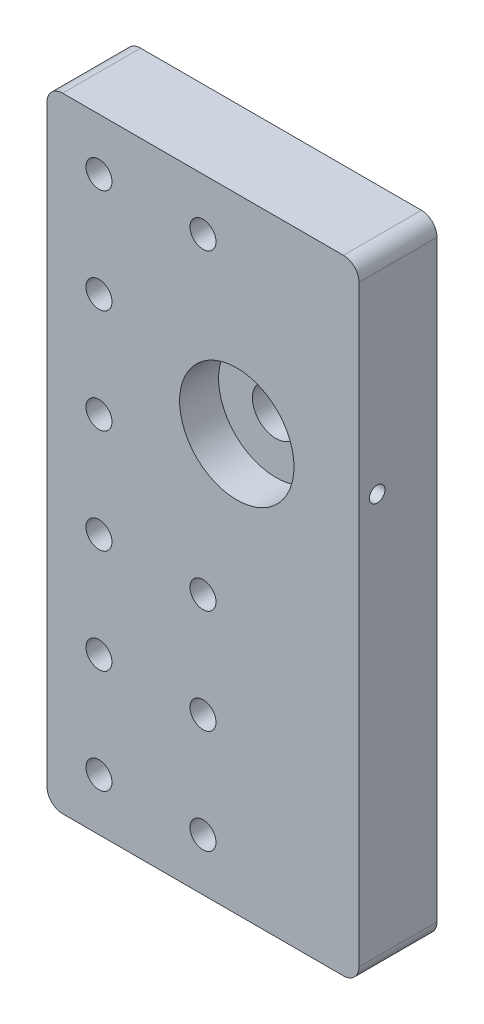
ISO-10303-21;
HEADER;
FILE_DESCRIPTION(('STEP AP214'),'2;1');
FILE_NAME('part.step','',(''),(''),'','','');
FILE_SCHEMA(('AUTOMOTIVE_DESIGN { 1 0 10303 214 1 1 1 1 }'));
ENDSEC;
DATA;
#1=APPLICATION_CONTEXT('core data for automotive mechanical design processes');
#2=APPLICATION_PROTOCOL_DEFINITION('international standard','automotive_design',2000,#1);
#3=PRODUCT_CONTEXT('',#1,'mechanical');
#4=PRODUCT('Part','Part','',(#3));
#5=PRODUCT_RELATED_PRODUCT_CATEGORY('part','',(#4));
#6=PRODUCT_DEFINITION_FORMATION('','',#4);
#7=PRODUCT_DEFINITION_CONTEXT('part definition',#1,'design');
#8=PRODUCT_DEFINITION('design','',#6,#7);
#9=PRODUCT_DEFINITION_SHAPE('','',#8);
#10=(LENGTH_UNIT() NAMED_UNIT(*) SI_UNIT(.MILLI.,.METRE.));
#11=(NAMED_UNIT(*) PLANE_ANGLE_UNIT() SI_UNIT($,.RADIAN.));
#12=(NAMED_UNIT(*) SI_UNIT($,.STERADIAN.) SOLID_ANGLE_UNIT());
#13=UNCERTAINTY_MEASURE_WITH_UNIT(LENGTH_MEASURE(1.E-05),#10,'distance_accuracy_value','');
#14=(GEOMETRIC_REPRESENTATION_CONTEXT(3) GLOBAL_UNCERTAINTY_ASSIGNED_CONTEXT((#13)) GLOBAL_UNIT_ASSIGNED_CONTEXT((#10,
#11,#12)) REPRESENTATION_CONTEXT('',''));
#15=CARTESIAN_POINT('',(0.,0.,0.));
#16=DIRECTION('',(0.,0.,1.));
#17=DIRECTION('',(1.,0.,0.));
#18=AXIS2_PLACEMENT_3D('',#15,#16,#17);
#19=CARTESIAN_POINT('',(36.5,80.,0.));
#20=DIRECTION('',(0.,0.,1.));
#21=DIRECTION('',(1.,0.,0.));
#22=AXIS2_PLACEMENT_3D('',#19,#20,#21);
#23=CYLINDRICAL_SURFACE('',#22,4.5);
#24=CARTESIAN_POINT('',(36.5,80.,0.));
#25=DIRECTION('',(0.,0.,1.));
#26=DIRECTION('',(1.,0.,0.));
#27=AXIS2_PLACEMENT_3D('',#24,#25,#26);
#28=CIRCLE('',#27,4.5);
#29=CARTESIAN_POINT('',(41.,80.,0.));
#30=VERTEX_POINT('',#29);
#31=EDGE_CURVE('E260',#30,#30,#28,.T.);
#32=ORIENTED_EDGE('',*,*,#31,.F.);
#33=EDGE_LOOP('',(#32));
#34=FACE_BOUND('',#33,.T.);
#35=CARTESIAN_POINT('',(36.5,80.,7.5));
#36=DIRECTION('',(0.,0.,1.));
#37=DIRECTION('',(1.,0.,0.));
#38=AXIS2_PLACEMENT_3D('',#35,#36,#37);
#39=CIRCLE('',#38,4.5);
#40=CARTESIAN_POINT('',(41.,80.,7.5));
#41=VERTEX_POINT('',#40);
#42=EDGE_CURVE('E424',#41,#41,#39,.T.);
#43=ORIENTED_EDGE('',*,*,#42,.T.);
#44=EDGE_LOOP('',(#43));
#45=FACE_BOUND('',#44,.T.);
#46=ADVANCED_FACE('F39',(#34,#45),#23,.F.);
#47=CARTESIAN_POINT('',(0.,0.,15.));
#48=DIRECTION('',(0.,0.,-1.));
#49=DIRECTION('',(-1.,0.,0.));
#50=AXIS2_PLACEMENT_3D('',#47,#48,#49);
#51=PLANE('',#50);
#52=CARTESIAN_POINT('',(36.5,80.,15.));
#53=DIRECTION('',(0.,0.,1.));
#54=DIRECTION('',(1.,0.,0.));
#55=AXIS2_PLACEMENT_3D('',#52,#53,#54);
#56=CIRCLE('',#55,11.);
#57=CARTESIAN_POINT('',(47.5,80.,15.));
#58=VERTEX_POINT('',#57);
#59=EDGE_CURVE('E422',#58,#58,#56,.T.);
#60=ORIENTED_EDGE('',*,*,#59,.F.);
#61=EDGE_LOOP('',(#60));
#62=FACE_BOUND('',#61,.T.);
#63=DIRECTION('',(0.,-1.,0.));
#64=VECTOR('',#63,1.);
#65=CARTESIAN_POINT('',(0.,0.,15.));
#66=LINE('',#65,#64);
#67=CARTESIAN_POINT('',(0.,117.,15.));
#68=VERTEX_POINT('',#67);
#69=CARTESIAN_POINT('',(0.,3.,15.));
#70=VERTEX_POINT('',#69);
#71=EDGE_CURVE('E149',#68,#70,#66,.T.);
#72=ORIENTED_EDGE('',*,*,#71,.T.);
#73=CARTESIAN_POINT('',(3.,3.,15.));
#74=DIRECTION('',(0.,0.,-1.));
#75=DIRECTION('',(-1.,0.,0.));
#76=AXIS2_PLACEMENT_3D('',#73,#74,#75);
#77=CIRCLE('',#76,3.);
#78=CARTESIAN_POINT('',(3.,0.,15.));
#79=VERTEX_POINT('',#78);
#80=EDGE_CURVE('E173',#70,#79,#77,.F.);
#81=ORIENTED_EDGE('',*,*,#80,.T.);
#82=DIRECTION('',(1.,0.,0.));
#83=VECTOR('',#82,1.);
#84=CARTESIAN_POINT('',(0.,0.,15.));
#85=LINE('',#84,#83);
#86=CARTESIAN_POINT('',(57.,0.,15.));
#87=VERTEX_POINT('',#86);
#88=EDGE_CURVE('E126',#79,#87,#85,.T.);
#89=ORIENTED_EDGE('',*,*,#88,.T.);
#90=CARTESIAN_POINT('',(57.,3.,15.));
#91=DIRECTION('',(0.,0.,-1.));
#92=DIRECTION('',(-1.,0.,0.));
#93=AXIS2_PLACEMENT_3D('',#90,#91,#92);
#94=CIRCLE('',#93,3.);
#95=CARTESIAN_POINT('',(60.,3.,15.));
#96=VERTEX_POINT('',#95);
#97=EDGE_CURVE('E170',#87,#96,#94,.F.);
#98=ORIENTED_EDGE('',*,*,#97,.T.);
#99=DIRECTION('',(0.,1.,0.));
#100=VECTOR('',#99,1.);
#101=CARTESIAN_POINT('',(60.,0.,15.));
#102=LINE('',#101,#100);
#103=CARTESIAN_POINT('',(60.,117.,15.));
#104=VERTEX_POINT('',#103);
#105=EDGE_CURVE('E199',#96,#104,#102,.T.);
#106=ORIENTED_EDGE('',*,*,#105,.T.);
#107=CARTESIAN_POINT('',(57.,117.,15.));
#108=DIRECTION('',(0.,0.,-1.));
#109=DIRECTION('',(-1.,0.,0.));
#110=AXIS2_PLACEMENT_3D('',#107,#108,#109);
#111=CIRCLE('',#110,3.);
#112=CARTESIAN_POINT('',(57.,120.,15.));
#113=VERTEX_POINT('',#112);
#114=EDGE_CURVE('E60',#104,#113,#111,.F.);
#115=ORIENTED_EDGE('',*,*,#114,.T.);
#116=DIRECTION('',(-1.,0.,0.));
#117=VECTOR('',#116,1.);
#118=CARTESIAN_POINT('',(0.,120.,15.));
#119=LINE('',#118,#117);
#120=CARTESIAN_POINT('',(3.,120.,15.));
#121=VERTEX_POINT('',#120);
#122=EDGE_CURVE('E151',#113,#121,#119,.T.);
#123=ORIENTED_EDGE('',*,*,#122,.T.);
#124=CARTESIAN_POINT('',(3.,117.,15.));
#125=DIRECTION('',(0.,0.,-1.));
#126=DIRECTION('',(-1.,0.,0.));
#127=AXIS2_PLACEMENT_3D('',#124,#125,#126);
#128=CIRCLE('',#127,3.);
#129=EDGE_CURVE('E167',#121,#68,#128,.F.);
#130=ORIENTED_EDGE('',*,*,#129,.T.);
#131=EDGE_LOOP('',(#72,#81,#89,#98,#106,#115,#123,#130));
#132=FACE_BOUND('',#131,.T.);
#133=CARTESIAN_POINT('',(10.,110.,15.));
#134=DIRECTION('',(0.,0.,1.));
#135=DIRECTION('',(1.,0.,0.));
#136=AXIS2_PLACEMENT_3D('',#133,#134,#135);
#137=CIRCLE('',#136,2.5);
#138=CARTESIAN_POINT('',(12.5,110.,15.));
#139=VERTEX_POINT('',#138);
#140=EDGE_CURVE('E143',#139,#139,#137,.T.);
#141=ORIENTED_EDGE('',*,*,#140,.F.);
#142=EDGE_LOOP('',(#141));
#143=FACE_BOUND('',#142,.T.);
#144=CARTESIAN_POINT('',(30.,110.,15.));
#145=DIRECTION('',(0.,0.,1.));
#146=DIRECTION('',(1.,0.,0.));
#147=AXIS2_PLACEMENT_3D('',#144,#145,#146);
#148=CIRCLE('',#147,2.5);
#149=CARTESIAN_POINT('',(32.5,110.,15.));
#150=VERTEX_POINT('',#149);
#151=EDGE_CURVE('E218',#150,#150,#148,.T.);
#152=ORIENTED_EDGE('',*,*,#151,.F.);
#153=EDGE_LOOP('',(#152));
#154=FACE_BOUND('',#153,.T.);
#155=CARTESIAN_POINT('',(10.,90.,15.));
#156=DIRECTION('',(0.,0.,1.));
#157=DIRECTION('',(1.,0.,0.));
#158=AXIS2_PLACEMENT_3D('',#155,#156,#157);
#159=CIRCLE('',#158,2.5);
#160=CARTESIAN_POINT('',(12.5,90.,15.));
#161=VERTEX_POINT('',#160);
#162=EDGE_CURVE('E222',#161,#161,#159,.T.);
#163=ORIENTED_EDGE('',*,*,#162,.F.);
#164=EDGE_LOOP('',(#163));
#165=FACE_BOUND('',#164,.T.);
#166=CARTESIAN_POINT('',(10.,70.,15.));
#167=DIRECTION('',(0.,0.,1.));
#168=DIRECTION('',(1.,0.,0.));
#169=AXIS2_PLACEMENT_3D('',#166,#167,#168);
#170=CIRCLE('',#169,2.5);
#171=CARTESIAN_POINT('',(12.5,70.,15.));
#172=VERTEX_POINT('',#171);
#173=EDGE_CURVE('E226',#172,#172,#170,.T.);
#174=ORIENTED_EDGE('',*,*,#173,.F.);
#175=EDGE_LOOP('',(#174));
#176=FACE_BOUND('',#175,.T.);
#177=CARTESIAN_POINT('',(10.,30.,15.));
#178=DIRECTION('',(0.,0.,1.));
#179=DIRECTION('',(1.,0.,0.));
#180=AXIS2_PLACEMENT_3D('',#177,#178,#179);
#181=CIRCLE('',#180,2.5);
#182=CARTESIAN_POINT('',(12.5,30.,15.));
#183=VERTEX_POINT('',#182);
#184=EDGE_CURVE('E230',#183,#183,#181,.T.);
#185=ORIENTED_EDGE('',*,*,#184,.F.);
#186=EDGE_LOOP('',(#185));
#187=FACE_BOUND('',#186,.T.);
#188=CARTESIAN_POINT('',(10.,10.,15.));
#189=DIRECTION('',(0.,0.,1.));
#190=DIRECTION('',(1.,0.,0.));
#191=AXIS2_PLACEMENT_3D('',#188,#189,#190);
#192=CIRCLE('',#191,2.5);
#193=CARTESIAN_POINT('',(12.5,10.,15.));
#194=VERTEX_POINT('',#193);
#195=EDGE_CURVE('E234',#194,#194,#192,.T.);
#196=ORIENTED_EDGE('',*,*,#195,.F.);
#197=EDGE_LOOP('',(#196));
#198=FACE_BOUND('',#197,.T.);
#199=CARTESIAN_POINT('',(30.,10.,15.));
#200=DIRECTION('',(0.,0.,1.));
#201=DIRECTION('',(1.,0.,0.));
#202=AXIS2_PLACEMENT_3D('',#199,#200,#201);
#203=CIRCLE('',#202,2.5);
#204=CARTESIAN_POINT('',(32.5,10.,15.));
#205=VERTEX_POINT('',#204);
#206=EDGE_CURVE('E238',#205,#205,#203,.T.);
#207=ORIENTED_EDGE('',*,*,#206,.F.);
#208=EDGE_LOOP('',(#207));
#209=FACE_BOUND('',#208,.T.);
#210=CARTESIAN_POINT('',(10.,50.,15.));
#211=DIRECTION('',(0.,0.,1.));
#212=DIRECTION('',(1.,0.,0.));
#213=AXIS2_PLACEMENT_3D('',#210,#211,#212);
#214=CIRCLE('',#213,2.5);
#215=CARTESIAN_POINT('',(12.5,50.,15.));
#216=VERTEX_POINT('',#215);
#217=EDGE_CURVE('E242',#216,#216,#214,.T.);
#218=ORIENTED_EDGE('',*,*,#217,.F.);
#219=EDGE_LOOP('',(#218));
#220=FACE_BOUND('',#219,.T.);
#221=CARTESIAN_POINT('',(30.,50.,15.));
#222=DIRECTION('',(0.,0.,1.));
#223=DIRECTION('',(1.,0.,0.));
#224=AXIS2_PLACEMENT_3D('',#221,#222,#223);
#225=CIRCLE('',#224,2.5);
#226=CARTESIAN_POINT('',(32.5,50.,15.));
#227=VERTEX_POINT('',#226);
#228=EDGE_CURVE('E246',#227,#227,#225,.T.);
#229=ORIENTED_EDGE('',*,*,#228,.F.);
#230=EDGE_LOOP('',(#229));
#231=FACE_BOUND('',#230,.T.);
#232=CARTESIAN_POINT('',(30.,30.,15.));
#233=DIRECTION('',(0.,0.,1.));
#234=DIRECTION('',(1.,0.,0.));
#235=AXIS2_PLACEMENT_3D('',#232,#233,#234);
#236=CIRCLE('',#235,2.5);
#237=CARTESIAN_POINT('',(32.5,30.,15.));
#238=VERTEX_POINT('',#237);
#239=EDGE_CURVE('E249',#238,#238,#236,.T.);
#240=ORIENTED_EDGE('',*,*,#239,.F.);
#241=EDGE_LOOP('',(#240));
#242=FACE_BOUND('',#241,.T.);
#243=ADVANCED_FACE('F207',(#62,#132,#143,#154,#165,#176,#187,#198,#209,#220,#231,#242),#51,.F.);
#244=CARTESIAN_POINT('',(0.,0.,0.));
#245=DIRECTION('',(0.,0.,-1.));
#246=DIRECTION('',(-1.,0.,0.));
#247=AXIS2_PLACEMENT_3D('',#244,#245,#246);
#248=PLANE('',#247);
#249=ORIENTED_EDGE('',*,*,#31,.T.);
#250=EDGE_LOOP('',(#249));
#251=FACE_BOUND('',#250,.T.);
#252=CARTESIAN_POINT('',(30.,50.,0.));
#253=DIRECTION('',(0.,0.,1.));
#254=DIRECTION('',(1.,0.,0.));
#255=AXIS2_PLACEMENT_3D('',#252,#253,#254);
#256=CIRCLE('',#255,2.5);
#257=CARTESIAN_POINT('',(32.5,50.,0.));
#258=VERTEX_POINT('',#257);
#259=EDGE_CURVE('E252',#258,#258,#256,.T.);
#260=ORIENTED_EDGE('',*,*,#259,.T.);
#261=EDGE_LOOP('',(#260));
#262=FACE_BOUND('',#261,.T.);
#263=CARTESIAN_POINT('',(30.,10.,0.));
#264=DIRECTION('',(0.,0.,1.));
#265=DIRECTION('',(1.,0.,0.));
#266=AXIS2_PLACEMENT_3D('',#263,#264,#265);
#267=CIRCLE('',#266,2.5);
#268=CARTESIAN_POINT('',(32.5,10.,0.));
#269=VERTEX_POINT('',#268);
#270=EDGE_CURVE('E270',#269,#269,#267,.T.);
#271=ORIENTED_EDGE('',*,*,#270,.T.);
#272=EDGE_LOOP('',(#271));
#273=FACE_BOUND('',#272,.T.);
#274=CARTESIAN_POINT('',(10.,30.,0.));
#275=DIRECTION('',(0.,0.,1.));
#276=DIRECTION('',(1.,0.,0.));
#277=AXIS2_PLACEMENT_3D('',#274,#275,#276);
#278=CIRCLE('',#277,2.5);
#279=CARTESIAN_POINT('',(12.5,30.,0.));
#280=VERTEX_POINT('',#279);
#281=EDGE_CURVE('E282',#280,#280,#278,.T.);
#282=ORIENTED_EDGE('',*,*,#281,.T.);
#283=EDGE_LOOP('',(#282));
#284=FACE_BOUND('',#283,.T.);
#285=CARTESIAN_POINT('',(10.,90.,0.));
#286=DIRECTION('',(0.,0.,1.));
#287=DIRECTION('',(1.,0.,0.));
#288=AXIS2_PLACEMENT_3D('',#285,#286,#287);
#289=CIRCLE('',#288,2.5);
#290=CARTESIAN_POINT('',(12.5,90.,0.));
#291=VERTEX_POINT('',#290);
#292=EDGE_CURVE('E294',#291,#291,#289,.T.);
#293=ORIENTED_EDGE('',*,*,#292,.T.);
#294=EDGE_LOOP('',(#293));
#295=FACE_BOUND('',#294,.T.);
#296=CARTESIAN_POINT('',(10.,110.,0.));
#297=DIRECTION('',(0.,0.,1.));
#298=DIRECTION('',(1.,0.,0.));
#299=AXIS2_PLACEMENT_3D('',#296,#297,#298);
#300=CIRCLE('',#299,2.5);
#301=CARTESIAN_POINT('',(12.5,110.,0.));
#302=VERTEX_POINT('',#301);
#303=EDGE_CURVE('E202',#302,#302,#300,.T.);
#304=ORIENTED_EDGE('',*,*,#303,.T.);
#305=EDGE_LOOP('',(#304));
#306=FACE_BOUND('',#305,.T.);
#307=DIRECTION('',(1.,0.,0.));
#308=VECTOR('',#307,1.);
#309=CARTESIAN_POINT('',(0.,0.,0.));
#310=LINE('',#309,#308);
#311=CARTESIAN_POINT('',(3.,0.,0.));
#312=VERTEX_POINT('',#311);
#313=CARTESIAN_POINT('',(57.,0.,0.));
#314=VERTEX_POINT('',#313);
#315=EDGE_CURVE('E123',#312,#314,#310,.T.);
#316=ORIENTED_EDGE('',*,*,#315,.F.);
#317=CARTESIAN_POINT('',(3.,3.,0.));
#318=DIRECTION('',(0.,0.,-1.));
#319=DIRECTION('',(-1.,0.,0.));
#320=AXIS2_PLACEMENT_3D('',#317,#318,#319);
#321=CIRCLE('',#320,3.);
#322=CARTESIAN_POINT('',(0.,3.,0.));
#323=VERTEX_POINT('',#322);
#324=EDGE_CURVE('E105',#312,#323,#321,.T.);
#325=ORIENTED_EDGE('',*,*,#324,.T.);
#326=DIRECTION('',(0.,-1.,0.));
#327=VECTOR('',#326,1.);
#328=CARTESIAN_POINT('',(0.,0.,0.));
#329=LINE('',#328,#327);
#330=CARTESIAN_POINT('',(0.,117.,0.));
#331=VERTEX_POINT('',#330);
#332=EDGE_CURVE('E136',#331,#323,#329,.T.);
#333=ORIENTED_EDGE('',*,*,#332,.F.);
#334=CARTESIAN_POINT('',(3.,117.,0.));
#335=DIRECTION('',(0.,0.,-1.));
#336=DIRECTION('',(-1.,0.,0.));
#337=AXIS2_PLACEMENT_3D('',#334,#335,#336);
#338=CIRCLE('',#337,3.);
#339=CARTESIAN_POINT('',(3.,120.,0.));
#340=VERTEX_POINT('',#339);
#341=EDGE_CURVE('E155',#331,#340,#338,.T.);
#342=ORIENTED_EDGE('',*,*,#341,.T.);
#343=DIRECTION('',(-1.,0.,0.));
#344=VECTOR('',#343,1.);
#345=CARTESIAN_POINT('',(0.,120.,0.));
#346=LINE('',#345,#344);
#347=CARTESIAN_POINT('',(57.,120.,0.));
#348=VERTEX_POINT('',#347);
#349=EDGE_CURVE('E141',#348,#340,#346,.T.);
#350=ORIENTED_EDGE('',*,*,#349,.F.);
#351=CARTESIAN_POINT('',(57.,117.,0.));
#352=DIRECTION('',(0.,0.,-1.));
#353=DIRECTION('',(-1.,0.,0.));
#354=AXIS2_PLACEMENT_3D('',#351,#352,#353);
#355=CIRCLE('',#354,3.);
#356=CARTESIAN_POINT('',(60.,117.,0.));
#357=VERTEX_POINT('',#356);
#358=EDGE_CURVE('E128',#348,#357,#355,.T.);
#359=ORIENTED_EDGE('',*,*,#358,.T.);
#360=DIRECTION('',(0.,1.,0.));
#361=VECTOR('',#360,1.);
#362=CARTESIAN_POINT('',(60.,0.,0.));
#363=LINE('',#362,#361);
#364=CARTESIAN_POINT('',(60.,3.,0.));
#365=VERTEX_POINT('',#364);
#366=EDGE_CURVE('E135',#365,#357,#363,.T.);
#367=ORIENTED_EDGE('',*,*,#366,.F.);
#368=CARTESIAN_POINT('',(57.,3.,0.));
#369=DIRECTION('',(0.,0.,-1.));
#370=DIRECTION('',(-1.,0.,0.));
#371=AXIS2_PLACEMENT_3D('',#368,#369,#370);
#372=CIRCLE('',#371,3.);
#373=EDGE_CURVE('E117',#365,#314,#372,.T.);
#374=ORIENTED_EDGE('',*,*,#373,.T.);
#375=EDGE_LOOP('',(#316,#325,#333,#342,#350,#359,#367,#374));
#376=FACE_BOUND('',#375,.T.);
#377=CARTESIAN_POINT('',(30.,110.,0.));
#378=DIRECTION('',(0.,0.,1.));
#379=DIRECTION('',(1.,0.,0.));
#380=AXIS2_PLACEMENT_3D('',#377,#378,#379);
#381=CIRCLE('',#380,2.5);
#382=CARTESIAN_POINT('',(32.5,110.,0.));
#383=VERTEX_POINT('',#382);
#384=EDGE_CURVE('E300',#383,#383,#381,.T.);
#385=ORIENTED_EDGE('',*,*,#384,.T.);
#386=EDGE_LOOP('',(#385));
#387=FACE_BOUND('',#386,.T.);
#388=CARTESIAN_POINT('',(10.,70.,0.));
#389=DIRECTION('',(0.,0.,1.));
#390=DIRECTION('',(1.,0.,0.));
#391=AXIS2_PLACEMENT_3D('',#388,#389,#390);
#392=CIRCLE('',#391,2.5);
#393=CARTESIAN_POINT('',(12.5,70.,0.));
#394=VERTEX_POINT('',#393);
#395=EDGE_CURVE('E288',#394,#394,#392,.T.);
#396=ORIENTED_EDGE('',*,*,#395,.T.);
#397=EDGE_LOOP('',(#396));
#398=FACE_BOUND('',#397,.T.);
#399=CARTESIAN_POINT('',(10.,10.,0.));
#400=DIRECTION('',(0.,0.,1.));
#401=DIRECTION('',(1.,0.,0.));
#402=AXIS2_PLACEMENT_3D('',#399,#400,#401);
#403=CIRCLE('',#402,2.5);
#404=CARTESIAN_POINT('',(12.5,10.,0.));
#405=VERTEX_POINT('',#404);
#406=EDGE_CURVE('E276',#405,#405,#403,.T.);
#407=ORIENTED_EDGE('',*,*,#406,.T.);
#408=EDGE_LOOP('',(#407));
#409=FACE_BOUND('',#408,.T.);
#410=CARTESIAN_POINT('',(10.,50.,0.));
#411=DIRECTION('',(0.,0.,1.));
#412=DIRECTION('',(1.,0.,0.));
#413=AXIS2_PLACEMENT_3D('',#410,#411,#412);
#414=CIRCLE('',#413,2.5);
#415=CARTESIAN_POINT('',(12.5,50.,0.));
#416=VERTEX_POINT('',#415);
#417=EDGE_CURVE('E266',#416,#416,#414,.T.);
#418=ORIENTED_EDGE('',*,*,#417,.T.);
#419=EDGE_LOOP('',(#418));
#420=FACE_BOUND('',#419,.T.);
#421=CARTESIAN_POINT('',(30.,30.,0.));
#422=DIRECTION('',(0.,0.,1.));
#423=DIRECTION('',(1.,0.,0.));
#424=AXIS2_PLACEMENT_3D('',#421,#422,#423);
#425=CIRCLE('',#424,2.5);
#426=CARTESIAN_POINT('',(32.5,30.,0.));
#427=VERTEX_POINT('',#426);
#428=EDGE_CURVE('E253',#427,#427,#425,.T.);
#429=ORIENTED_EDGE('',*,*,#428,.T.);
#430=EDGE_LOOP('',(#429));
#431=FACE_BOUND('',#430,.T.);
#432=ADVANCED_FACE('F131',(#251,#262,#273,#284,#295,#306,#376,#387,#398,#409,#420,#431),#248,.T.);
#433=CARTESIAN_POINT('',(0.,0.,15.));
#434=DIRECTION('',(1.,0.,0.));
#435=DIRECTION('',(0.,0.,-1.));
#436=AXIS2_PLACEMENT_3D('',#433,#434,#435);
#437=PLANE('',#436);
#438=ORIENTED_EDGE('',*,*,#332,.T.);
#439=DIRECTION('',(0.,0.,-1.));
#440=VECTOR('',#439,1.);
#441=CARTESIAN_POINT('',(0.,3.,15.));
#442=LINE('',#441,#440);
#443=EDGE_CURVE('E110',#323,#70,#442,.F.);
#444=ORIENTED_EDGE('',*,*,#443,.T.);
#445=ORIENTED_EDGE('',*,*,#71,.F.);
#446=DIRECTION('',(0.,0.,-1.));
#447=VECTOR('',#446,1.);
#448=CARTESIAN_POINT('',(0.,117.,15.));
#449=LINE('',#448,#447);
#450=EDGE_CURVE('E116',#68,#331,#449,.T.);
#451=ORIENTED_EDGE('',*,*,#450,.T.);
#452=EDGE_LOOP('',(#438,#444,#445,#451));
#453=FACE_BOUND('',#452,.T.);
#454=ADVANCED_FACE('F194',(#453),#437,.F.);
#455=CARTESIAN_POINT('',(0.,0.,15.));
#456=DIRECTION('',(0.,1.,0.));
#457=DIRECTION('',(0.,0.,1.));
#458=AXIS2_PLACEMENT_3D('',#455,#456,#457);
#459=PLANE('',#458);
#460=ORIENTED_EDGE('',*,*,#88,.F.);
#461=DIRECTION('',(0.,0.,-1.));
#462=VECTOR('',#461,1.);
#463=CARTESIAN_POINT('',(3.,0.,15.));
#464=LINE('',#463,#462);
#465=EDGE_CURVE('E109',#79,#312,#464,.T.);
#466=ORIENTED_EDGE('',*,*,#465,.T.);
#467=ORIENTED_EDGE('',*,*,#315,.T.);
#468=DIRECTION('',(0.,0.,-1.));
#469=VECTOR('',#468,1.);
#470=CARTESIAN_POINT('',(57.,0.,15.));
#471=LINE('',#470,#469);
#472=EDGE_CURVE('E129',#314,#87,#471,.F.);
#473=ORIENTED_EDGE('',*,*,#472,.T.);
#474=EDGE_LOOP('',(#460,#466,#467,#473));
#475=FACE_BOUND('',#474,.T.);
#476=ADVANCED_FACE('F122',(#475),#459,.F.);
#477=CARTESIAN_POINT('',(60.,0.,15.));
#478=DIRECTION('',(-1.,0.,0.));
#479=DIRECTION('',(0.,0.,1.));
#480=AXIS2_PLACEMENT_3D('',#477,#478,#479);
#481=PLANE('',#480);
#482=CARTESIAN_POINT('',(60.,80.,11.5));
#483=DIRECTION('',(1.,0.,0.));
#484=DIRECTION('',(0.,0.,-1.));
#485=AXIS2_PLACEMENT_3D('',#482,#483,#484);
#486=CIRCLE('',#485,1.5);
#487=CARTESIAN_POINT('',(60.,80.,10.));
#488=VERTEX_POINT('',#487);
#489=EDGE_CURVE('E425',#488,#488,#486,.T.);
#490=ORIENTED_EDGE('',*,*,#489,.F.);
#491=EDGE_LOOP('',(#490));
#492=FACE_BOUND('',#491,.T.);
#493=ORIENTED_EDGE('',*,*,#105,.F.);
#494=DIRECTION('',(0.,0.,-1.));
#495=VECTOR('',#494,1.);
#496=CARTESIAN_POINT('',(60.,3.,15.));
#497=LINE('',#496,#495);
#498=EDGE_CURVE('E179',#96,#365,#497,.T.);
#499=ORIENTED_EDGE('',*,*,#498,.T.);
#500=ORIENTED_EDGE('',*,*,#366,.T.);
#501=DIRECTION('',(0.,0.,-1.));
#502=VECTOR('',#501,1.);
#503=CARTESIAN_POINT('',(60.,117.,15.));
#504=LINE('',#503,#502);
#505=EDGE_CURVE('E176',#357,#104,#504,.F.);
#506=ORIENTED_EDGE('',*,*,#505,.T.);
#507=EDGE_LOOP('',(#493,#499,#500,#506));
#508=FACE_BOUND('',#507,.T.);
#509=ADVANCED_FACE('F326',(#492,#508),#481,.F.);
#510=CARTESIAN_POINT('',(0.,120.,15.));
#511=DIRECTION('',(0.,-1.,0.));
#512=DIRECTION('',(0.,0.,-1.));
#513=AXIS2_PLACEMENT_3D('',#510,#511,#512);
#514=PLANE('',#513);
#515=ORIENTED_EDGE('',*,*,#349,.T.);
#516=DIRECTION('',(0.,0.,-1.));
#517=VECTOR('',#516,1.);
#518=CARTESIAN_POINT('',(3.,120.,15.));
#519=LINE('',#518,#517);
#520=EDGE_CURVE('E11',#340,#121,#519,.F.);
#521=ORIENTED_EDGE('',*,*,#520,.T.);
#522=ORIENTED_EDGE('',*,*,#122,.F.);
#523=DIRECTION('',(0.,0.,-1.));
#524=VECTOR('',#523,1.);
#525=CARTESIAN_POINT('',(57.,120.,15.));
#526=LINE('',#525,#524);
#527=EDGE_CURVE('E48',#113,#348,#526,.T.);
#528=ORIENTED_EDGE('',*,*,#527,.T.);
#529=EDGE_LOOP('',(#515,#521,#522,#528));
#530=FACE_BOUND('',#529,.T.);
#531=ADVANCED_FACE('F186',(#530),#514,.F.);
#532=CARTESIAN_POINT('',(10.,110.,15.));
#533=DIRECTION('',(0.,0.,-1.));
#534=DIRECTION('',(-1.,0.,0.));
#535=AXIS2_PLACEMENT_3D('',#532,#533,#534);
#536=CYLINDRICAL_SURFACE('',#535,2.5);
#537=ORIENTED_EDGE('',*,*,#140,.T.);
#538=EDGE_LOOP('',(#537));
#539=FACE_BOUND('',#538,.T.);
#540=ORIENTED_EDGE('',*,*,#303,.F.);
#541=EDGE_LOOP('',(#540));
#542=FACE_BOUND('',#541,.T.);
#543=ADVANCED_FACE('F315',(#539,#542),#536,.F.);
#544=CARTESIAN_POINT('',(30.,110.,15.));
#545=DIRECTION('',(0.,0.,-1.));
#546=DIRECTION('',(-1.,0.,0.));
#547=AXIS2_PLACEMENT_3D('',#544,#545,#546);
#548=CYLINDRICAL_SURFACE('',#547,2.5);
#549=ORIENTED_EDGE('',*,*,#151,.T.);
#550=EDGE_LOOP('',(#549));
#551=FACE_BOUND('',#550,.T.);
#552=ORIENTED_EDGE('',*,*,#384,.F.);
#553=EDGE_LOOP('',(#552));
#554=FACE_BOUND('',#553,.T.);
#555=ADVANCED_FACE('F317',(#551,#554),#548,.F.);
#556=CARTESIAN_POINT('',(10.,90.,15.));
#557=DIRECTION('',(0.,0.,-1.));
#558=DIRECTION('',(-1.,0.,0.));
#559=AXIS2_PLACEMENT_3D('',#556,#557,#558);
#560=CYLINDRICAL_SURFACE('',#559,2.5);
#561=ORIENTED_EDGE('',*,*,#162,.T.);
#562=EDGE_LOOP('',(#561));
#563=FACE_BOUND('',#562,.T.);
#564=ORIENTED_EDGE('',*,*,#292,.F.);
#565=EDGE_LOOP('',(#564));
#566=FACE_BOUND('',#565,.T.);
#567=ADVANCED_FACE('F323',(#563,#566),#560,.F.);
#568=CARTESIAN_POINT('',(10.,70.,15.));
#569=DIRECTION('',(0.,0.,-1.));
#570=DIRECTION('',(-1.,0.,0.));
#571=AXIS2_PLACEMENT_3D('',#568,#569,#570);
#572=CYLINDRICAL_SURFACE('',#571,2.5);
#573=ORIENTED_EDGE('',*,*,#173,.T.);
#574=EDGE_LOOP('',(#573));
#575=FACE_BOUND('',#574,.T.);
#576=ORIENTED_EDGE('',*,*,#395,.F.);
#577=EDGE_LOOP('',(#576));
#578=FACE_BOUND('',#577,.T.);
#579=ADVANCED_FACE('F361',(#575,#578),#572,.F.);
#580=CARTESIAN_POINT('',(10.,30.,15.));
#581=DIRECTION('',(0.,0.,-1.));
#582=DIRECTION('',(-1.,0.,0.));
#583=AXIS2_PLACEMENT_3D('',#580,#581,#582);
#584=CYLINDRICAL_SURFACE('',#583,2.5);
#585=ORIENTED_EDGE('',*,*,#184,.T.);
#586=EDGE_LOOP('',(#585));
#587=FACE_BOUND('',#586,.T.);
#588=ORIENTED_EDGE('',*,*,#281,.F.);
#589=EDGE_LOOP('',(#588));
#590=FACE_BOUND('',#589,.T.);
#591=ADVANCED_FACE('F357',(#587,#590),#584,.F.);
#592=CARTESIAN_POINT('',(10.,10.,15.));
#593=DIRECTION('',(0.,0.,-1.));
#594=DIRECTION('',(-1.,0.,0.));
#595=AXIS2_PLACEMENT_3D('',#592,#593,#594);
#596=CYLINDRICAL_SURFACE('',#595,2.5);
#597=ORIENTED_EDGE('',*,*,#195,.T.);
#598=EDGE_LOOP('',(#597));
#599=FACE_BOUND('',#598,.T.);
#600=ORIENTED_EDGE('',*,*,#406,.F.);
#601=EDGE_LOOP('',(#600));
#602=FACE_BOUND('',#601,.T.);
#603=ADVANCED_FACE('F353',(#599,#602),#596,.F.);
#604=CARTESIAN_POINT('',(30.,10.,15.));
#605=DIRECTION('',(0.,0.,-1.));
#606=DIRECTION('',(-1.,0.,0.));
#607=AXIS2_PLACEMENT_3D('',#604,#605,#606);
#608=CYLINDRICAL_SURFACE('',#607,2.5);
#609=ORIENTED_EDGE('',*,*,#206,.T.);
#610=EDGE_LOOP('',(#609));
#611=FACE_BOUND('',#610,.T.);
#612=ORIENTED_EDGE('',*,*,#270,.F.);
#613=EDGE_LOOP('',(#612));
#614=FACE_BOUND('',#613,.T.);
#615=ADVANCED_FACE('F349',(#611,#614),#608,.F.);
#616=CARTESIAN_POINT('',(10.,50.,15.));
#617=DIRECTION('',(0.,0.,-1.));
#618=DIRECTION('',(-1.,0.,0.));
#619=AXIS2_PLACEMENT_3D('',#616,#617,#618);
#620=CYLINDRICAL_SURFACE('',#619,2.5);
#621=ORIENTED_EDGE('',*,*,#217,.T.);
#622=EDGE_LOOP('',(#621));
#623=FACE_BOUND('',#622,.T.);
#624=ORIENTED_EDGE('',*,*,#417,.F.);
#625=EDGE_LOOP('',(#624));
#626=FACE_BOUND('',#625,.T.);
#627=ADVANCED_FACE('F345',(#623,#626),#620,.F.);
#628=CARTESIAN_POINT('',(30.,50.,15.));
#629=DIRECTION('',(0.,0.,-1.));
#630=DIRECTION('',(-1.,0.,0.));
#631=AXIS2_PLACEMENT_3D('',#628,#629,#630);
#632=CYLINDRICAL_SURFACE('',#631,2.5);
#633=ORIENTED_EDGE('',*,*,#228,.T.);
#634=EDGE_LOOP('',(#633));
#635=FACE_BOUND('',#634,.T.);
#636=ORIENTED_EDGE('',*,*,#259,.F.);
#637=EDGE_LOOP('',(#636));
#638=FACE_BOUND('',#637,.T.);
#639=ADVANCED_FACE('F342',(#635,#638),#632,.F.);
#640=CARTESIAN_POINT('',(30.,30.,15.));
#641=DIRECTION('',(0.,0.,-1.));
#642=DIRECTION('',(-1.,0.,0.));
#643=AXIS2_PLACEMENT_3D('',#640,#641,#642);
#644=CYLINDRICAL_SURFACE('',#643,2.5);
#645=ORIENTED_EDGE('',*,*,#239,.T.);
#646=EDGE_LOOP('',(#645));
#647=FACE_BOUND('',#646,.T.);
#648=ORIENTED_EDGE('',*,*,#428,.F.);
#649=EDGE_LOOP('',(#648));
#650=FACE_BOUND('',#649,.T.);
#651=ADVANCED_FACE('F339',(#647,#650),#644,.F.);
#652=CARTESIAN_POINT('',(3.,3.,15.));
#653=DIRECTION('',(0.,0.,-1.));
#654=DIRECTION('',(-1.,0.,0.));
#655=AXIS2_PLACEMENT_3D('',#652,#653,#654);
#656=CYLINDRICAL_SURFACE('',#655,3.);
#657=ORIENTED_EDGE('',*,*,#80,.F.);
#658=ORIENTED_EDGE('',*,*,#443,.F.);
#659=ORIENTED_EDGE('',*,*,#324,.F.);
#660=ORIENTED_EDGE('',*,*,#465,.F.);
#661=EDGE_LOOP('',(#657,#658,#659,#660));
#662=FACE_BOUND('',#661,.T.);
#663=ADVANCED_FACE('F108',(#662),#656,.T.);
#664=CARTESIAN_POINT('',(57.,3.,15.));
#665=DIRECTION('',(0.,0.,-1.));
#666=DIRECTION('',(-1.,0.,0.));
#667=AXIS2_PLACEMENT_3D('',#664,#665,#666);
#668=CYLINDRICAL_SURFACE('',#667,3.);
#669=ORIENTED_EDGE('',*,*,#97,.F.);
#670=ORIENTED_EDGE('',*,*,#472,.F.);
#671=ORIENTED_EDGE('',*,*,#373,.F.);
#672=ORIENTED_EDGE('',*,*,#498,.F.);
#673=EDGE_LOOP('',(#669,#670,#671,#672));
#674=FACE_BOUND('',#673,.T.);
#675=ADVANCED_FACE('F390',(#674),#668,.T.);
#676=CARTESIAN_POINT('',(3.,117.,15.));
#677=DIRECTION('',(0.,0.,-1.));
#678=DIRECTION('',(-1.,0.,0.));
#679=AXIS2_PLACEMENT_3D('',#676,#677,#678);
#680=CYLINDRICAL_SURFACE('',#679,3.);
#681=ORIENTED_EDGE('',*,*,#129,.F.);
#682=ORIENTED_EDGE('',*,*,#520,.F.);
#683=ORIENTED_EDGE('',*,*,#341,.F.);
#684=ORIENTED_EDGE('',*,*,#450,.F.);
#685=EDGE_LOOP('',(#681,#682,#683,#684));
#686=FACE_BOUND('',#685,.T.);
#687=ADVANCED_FACE('F191',(#686),#680,.T.);
#688=CARTESIAN_POINT('',(57.,117.,15.));
#689=DIRECTION('',(0.,0.,-1.));
#690=DIRECTION('',(-1.,0.,0.));
#691=AXIS2_PLACEMENT_3D('',#688,#689,#690);
#692=CYLINDRICAL_SURFACE('',#691,3.);
#693=ORIENTED_EDGE('',*,*,#114,.F.);
#694=ORIENTED_EDGE('',*,*,#505,.F.);
#695=ORIENTED_EDGE('',*,*,#358,.F.);
#696=ORIENTED_EDGE('',*,*,#527,.F.);
#697=EDGE_LOOP('',(#693,#694,#695,#696));
#698=FACE_BOUND('',#697,.T.);
#699=ADVANCED_FACE('F41',(#698),#692,.T.);
#700=CARTESIAN_POINT('',(36.5,80.,7.5));
#701=DIRECTION('',(0.,0.,1.));
#702=DIRECTION('',(1.,0.,0.));
#703=AXIS2_PLACEMENT_3D('',#700,#701,#702);
#704=CYLINDRICAL_SURFACE('',#703,11.);
#705=CARTESIAN_POINT('',(47.5,80.,10.));
#706=CARTESIAN_POINT('',(47.4999987467262,79.9161615865701,10.0000035194574));
#707=CARTESIAN_POINT('',(47.4990314271488,79.8322723977103,10.0070525926726));
#708=CARTESIAN_POINT('',(47.4952656640845,79.6668329023586,10.0350588832243));
#709=CARTESIAN_POINT('',(47.492465364401,79.5852850543401,10.0560301994498));
#710=CARTESIAN_POINT('',(47.4853487739829,79.4269469063064,10.1112477338406));
#711=CARTESIAN_POINT('',(47.4810335583919,79.3501532775468,10.1454845392021));
#712=CARTESIAN_POINT('',(47.471365727223,79.2034146975503,10.2262395245602));
#713=CARTESIAN_POINT('',(47.4660132749006,79.1334686711413,10.2727557722543));
#714=CARTESIAN_POINT('',(47.4548285996925,79.0019424361877,10.3770722142923));
#715=CARTESIAN_POINT('',(47.4489937690522,78.9404132153762,10.4349364230035));
#716=CARTESIAN_POINT('',(47.4375227155932,78.8279066609195,10.5601686107924));
#717=CARTESIAN_POINT('',(47.4318865034525,78.776929893872,10.6275370998613));
#718=CARTESIAN_POINT('',(47.4214253777188,78.6867814947507,10.7702019382241));
#719=CARTESIAN_POINT('',(47.416603830108,78.647658335316,10.8455291850052));
#720=CARTESIAN_POINT('',(47.4083529406776,78.5826373551472,11.0017618153737));
#721=CARTESIAN_POINT('',(47.404923536173,78.5567389389201,11.0826669476098));
#722=CARTESIAN_POINT('',(47.3998704969217,78.5190590944491,11.2472262435736));
#723=CARTESIAN_POINT('',(47.3982357822449,78.5071910113545,11.3308602192911));
#724=CARTESIAN_POINT('',(47.3969234380482,78.4976404494033,11.4989474730241));
#725=CARTESIAN_POINT('',(47.3972457153308,78.4999572950202,11.5834007118328));
#726=CARTESIAN_POINT('',(47.3998008033656,78.5186398298076,11.7501217256009));
#727=CARTESIAN_POINT('',(47.4020205710196,78.5349096108241,11.8324004763672));
#728=CARTESIAN_POINT('',(47.4081001740818,78.580886323047,11.9930490405327));
#729=CARTESIAN_POINT('',(47.411960048455,78.6105935734975,12.071418761013));
#730=CARTESIAN_POINT('',(47.420899582937,78.6827035823979,12.2223199260376));
#731=CARTESIAN_POINT('',(47.4259831927575,78.7251475614224,12.294831429268));
#732=CARTESIAN_POINT('',(47.4367944433469,78.8214967695518,12.4317391488858));
#733=CARTESIAN_POINT('',(47.4425221191218,78.8754026217696,12.4961349237667));
#734=CARTESIAN_POINT('',(47.454033973898,78.993674722162,12.6155395544946));
#735=CARTESIAN_POINT('',(47.4598182294108,79.0581235492658,12.6704666403124));
#736=CARTESIAN_POINT('',(47.4707474705779,79.1953690555946,12.7687364915984));
#737=CARTESIAN_POINT('',(47.4758924542398,79.2681657608354,12.812079220963));
#738=CARTESIAN_POINT('',(47.4849675408771,79.4201070305195,12.88595186318));
#739=CARTESIAN_POINT('',(47.4888971094847,79.4992543678687,12.9164761423927));
#740=CARTESIAN_POINT('',(47.4950939520307,79.6616169120601,12.9637778379456));
#741=CARTESIAN_POINT('',(47.497361318692,79.7448318917199,12.9805560210935));
#742=CARTESIAN_POINT('',(47.4999661380375,79.9122610926323,12.9997820845656));
#743=CARTESIAN_POINT('',(47.5003187469014,79.9964621636121,13.0023425085886));
#744=CARTESIAN_POINT('',(47.4990953877098,80.1640922940892,12.9933581216693));
#745=CARTESIAN_POINT('',(47.4975194687383,80.2475213731804,12.9818136697171));
#746=CARTESIAN_POINT('',(47.4926255265792,80.4109033783649,12.9450407767903));
#747=CARTESIAN_POINT('',(47.4893144012332,80.4908687206206,12.9198665044287));
#748=CARTESIAN_POINT('',(47.4813204406363,80.6454431410956,12.8566052409671));
#749=CARTESIAN_POINT('',(47.4766375509031,80.7200520064252,12.8185177369828));
#750=CARTESIAN_POINT('',(47.4663836303603,80.8622948929824,12.730242461276));
#751=CARTESIAN_POINT('',(47.460807370571,80.9298837283532,12.6799824971996));
#752=CARTESIAN_POINT('',(47.4494055314267,81.0557070132546,12.5688904220426));
#753=CARTESIAN_POINT('',(47.4435799402192,81.1139410174533,12.5080578079433));
#754=CARTESIAN_POINT('',(47.4322886877303,81.2198053295411,12.3770491669916));
#755=CARTESIAN_POINT('',(47.4268257501214,81.2673606638064,12.3068122865189));
#756=CARTESIAN_POINT('',(47.4169246504416,81.3499983954926,12.1592816923002));
#757=CARTESIAN_POINT('',(47.4124864646235,81.3850810819614,12.0819881421414));
#758=CARTESIAN_POINT('',(47.4051564726067,81.4416584950515,11.9227722433268));
#759=CARTESIAN_POINT('',(47.402259998972,81.4631942705001,11.8408647055639));
#760=CARTESIAN_POINT('',(47.3983284316023,81.4921981054752,11.674553478172));
#761=CARTESIAN_POINT('',(47.3972932333409,81.499666954979,11.5901499289857));
#762=CARTESIAN_POINT('',(47.3972048541528,81.5003085658472,11.421989024609));
#763=CARTESIAN_POINT('',(47.3981353386205,81.4935991469064,11.3382321033916));
#764=CARTESIAN_POINT('',(47.4018382005365,81.4663254643853,11.1730488613015));
#765=CARTESIAN_POINT('',(47.4046105769335,81.4457612087119,11.0916225390988));
#766=CARTESIAN_POINT('',(47.4116795081979,81.3914005645048,10.9334348606149));
#767=CARTESIAN_POINT('',(47.4159752803929,81.3576109698069,10.8566711325175));
#768=CARTESIAN_POINT('',(47.425608111245,81.2777703983912,10.7098837013936));
#769=CARTESIAN_POINT('',(47.4309451926623,81.2317191536582,10.6398601457395));
#770=CARTESIAN_POINT('',(47.4421122992185,81.1282291522308,10.5079399634002));
#771=CARTESIAN_POINT('',(47.4479459056036,81.070702784234,10.4461123637775));
#772=CARTESIAN_POINT('',(47.4594178730356,80.9460798680536,10.3329446532892));
#773=CARTESIAN_POINT('',(47.4650561880416,80.8789810819578,10.2816070016886));
#774=CARTESIAN_POINT('',(47.4755309296992,80.736765493202,10.1906740326166));
#775=CARTESIAN_POINT('',(47.4803636164562,80.6616138185173,10.1511328417237));
#776=CARTESIAN_POINT('',(47.4886453705716,80.5057096939303,10.085290518947));
#777=CARTESIAN_POINT('',(47.4920959102772,80.4249633120219,10.0589752903063));
#778=CARTESIAN_POINT('',(47.4964117606731,80.2865185970872,10.0264895629361));
#779=CARTESIAN_POINT('',(47.4977506427886,80.229685788696,10.0165706392027));
#780=CARTESIAN_POINT('',(47.4995451890738,80.1152433136469,10.0033246790188));
#781=CARTESIAN_POINT('',(47.5000008615472,80.0576336542977,9.99999758059365));
#782=CARTESIAN_POINT('',(47.5,80.,10.));
#783=B_SPLINE_CURVE_WITH_KNOTS('',3,(#705,#706,#707,#708,#709,#710,#711,#712,#713,#714,#715,
#716,#717,#718,#719,#720,#721,#722,#723,#724,#725,#726,#727,#728,#729,#730,#731,#732,#733,#734,
#735,#736,#737,#738,#739,#740,#741,#742,#743,#744,#745,#746,#747,#748,#749,#750,#751,#752,#753,
#754,#755,#756,#757,#758,#759,#760,#761,#762,#763,#764,#765,#766,#767,#768,#769,#770,#771,#772,
#773,#774,#775,#776,#777,#778,#779,#780,#781,#782),.UNSPECIFIED.,.T.,.F.,(4,2,2,2,2,2,2,2,2,2,2,
2,2,2,2,2,2,2,2,2,2,2,2,2,2,2,2,2,2,2,2,2,2,2,2,2,2,2,4),(0.,0.251304688086144,
0.502864258429492,0.754245655375313,1.00558751830525,1.25839025869504,1.51120656941611,
1.76504317927172,2.01886835818389,2.27111752000617,2.52335466910191,2.77387178872724,
3.02439486038875,3.27573762185034,3.52709405079554,3.78052284746838,4.0339524339601,
4.28749328511461,4.54101999186669,4.79253696204823,5.0440475308801,5.29456578809544,
5.54509399649482,5.79714607697892,6.04921015271754,6.30299215129409,6.55676826820729,
6.80977166004952,7.06276084317859,7.3136559874506,7.56455098853992,7.81531727406241,
8.0660890412842,8.31885423544368,8.5716786200941,8.82564582024678,9.0793417549426,
9.25209960062626,9.42485582207674),.UNSPECIFIED.);
#784=CARTESIAN_POINT('',(47.5,80.,10.));
#785=VERTEX_POINT('',#784);
#786=EDGE_CURVE('E415',#785,#785,#783,.T.);
#787=ORIENTED_EDGE('',*,*,#786,.F.);
#788=EDGE_LOOP('',(#787));
#789=FACE_BOUND('',#788,.T.);
#790=CARTESIAN_POINT('',(36.5,80.,7.5));
#791=DIRECTION('',(0.,0.,1.));
#792=DIRECTION('',(1.,0.,0.));
#793=AXIS2_PLACEMENT_3D('',#790,#791,#792);
#794=CIRCLE('',#793,11.);
#795=CARTESIAN_POINT('',(47.5,80.,7.5));
#796=VERTEX_POINT('',#795);
#797=EDGE_CURVE('E419',#796,#796,#794,.T.);
#798=ORIENTED_EDGE('',*,*,#797,.F.);
#799=EDGE_LOOP('',(#798));
#800=FACE_BOUND('',#799,.T.);
#801=ORIENTED_EDGE('',*,*,#59,.T.);
#802=EDGE_LOOP('',(#801));
#803=FACE_BOUND('',#802,.T.);
#804=ADVANCED_FACE('F337',(#789,#800,#803),#704,.F.);
#805=CARTESIAN_POINT('',(0.,0.,7.5));
#806=DIRECTION('',(0.,0.,1.));
#807=DIRECTION('',(1.,0.,0.));
#808=AXIS2_PLACEMENT_3D('',#805,#806,#807);
#809=PLANE('',#808);
#810=ORIENTED_EDGE('',*,*,#42,.F.);
#811=EDGE_LOOP('',(#810));
#812=FACE_BOUND('',#811,.T.);
#813=ORIENTED_EDGE('',*,*,#797,.T.);
#814=EDGE_LOOP('',(#813));
#815=FACE_BOUND('',#814,.T.);
#816=ADVANCED_FACE('F400',(#812,#815),#809,.T.);
#817=CARTESIAN_POINT('',(-0.001000000000001,80.,11.5));
#818=DIRECTION('',(1.,0.,0.));
#819=DIRECTION('',(0.,0.,-1.));
#820=AXIS2_PLACEMENT_3D('',#817,#818,#819);
#821=CYLINDRICAL_SURFACE('',#820,1.5);
#822=ORIENTED_EDGE('',*,*,#489,.T.);
#823=EDGE_LOOP('',(#822));
#824=FACE_BOUND('',#823,.T.);
#825=ORIENTED_EDGE('',*,*,#786,.T.);
#826=EDGE_LOOP('',(#825));
#827=FACE_BOUND('',#826,.T.);
#828=ADVANCED_FACE('F410',(#824,#827),#821,.F.);
#829=CLOSED_SHELL('',(#46,#243,#432,#454,#476,#509,#531,#543,#555,#567,#579,#591,#603,#615,#627,
#639,#651,#663,#675,#687,#699,#804,#816,#828));
#830=MANIFOLD_SOLID_BREP('B2',#829);
#831=ADVANCED_BREP_SHAPE_REPRESENTATION('',(#18,#830),#14);
#832=SHAPE_DEFINITION_REPRESENTATION(#9,#831);
ENDSEC;
END-ISO-10303-21;
